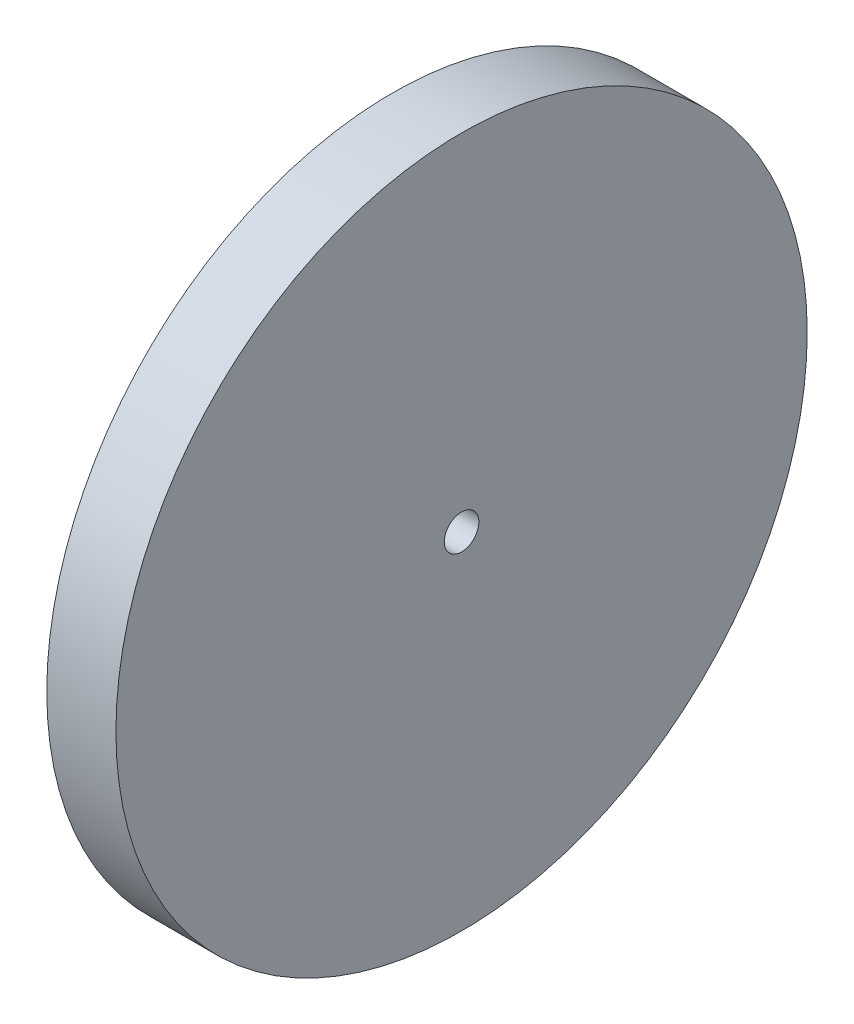
ISO-10303-21;
HEADER;
FILE_DESCRIPTION(('STEP AP214'),'2;1');
FILE_NAME('part.step','',(''),(''),'','','');
FILE_SCHEMA(('AUTOMOTIVE_DESIGN { 1 0 10303 214 1 1 1 1 }'));
ENDSEC;
DATA;
#1=APPLICATION_CONTEXT('core data for automotive mechanical design processes');
#2=APPLICATION_PROTOCOL_DEFINITION('international standard','automotive_design',2000,#1);
#3=PRODUCT_CONTEXT('',#1,'mechanical');
#4=PRODUCT('Part','Part','',(#3));
#5=PRODUCT_RELATED_PRODUCT_CATEGORY('part','',(#4));
#6=PRODUCT_DEFINITION_FORMATION('','',#4);
#7=PRODUCT_DEFINITION_CONTEXT('part definition',#1,'design');
#8=PRODUCT_DEFINITION('design','',#6,#7);
#9=PRODUCT_DEFINITION_SHAPE('','',#8);
#10=(LENGTH_UNIT() NAMED_UNIT(*) SI_UNIT(.MILLI.,.METRE.));
#11=(NAMED_UNIT(*) PLANE_ANGLE_UNIT() SI_UNIT($,.RADIAN.));
#12=(NAMED_UNIT(*) SI_UNIT($,.STERADIAN.) SOLID_ANGLE_UNIT());
#13=UNCERTAINTY_MEASURE_WITH_UNIT(LENGTH_MEASURE(1.E-05),#10,'distance_accuracy_value','');
#14=(GEOMETRIC_REPRESENTATION_CONTEXT(3) GLOBAL_UNCERTAINTY_ASSIGNED_CONTEXT((#13)) GLOBAL_UNIT_ASSIGNED_CONTEXT((#10,
#11,#12)) REPRESENTATION_CONTEXT('',''));
#15=CARTESIAN_POINT('',(0.,0.,0.));
#16=DIRECTION('',(0.,0.,1.));
#17=DIRECTION('',(1.,0.,0.));
#18=AXIS2_PLACEMENT_3D('',#15,#16,#17);
#19=CARTESIAN_POINT('',(-5.,0.,0.));
#20=DIRECTION('',(1.,0.,0.));
#21=DIRECTION('',(0.,0.,-1.));
#22=AXIS2_PLACEMENT_3D('',#19,#20,#21);
#23=CYLINDRICAL_SURFACE('',#22,50.);
#24=CARTESIAN_POINT('',(-5.,0.,0.));
#25=DIRECTION('',(1.,0.,0.));
#26=DIRECTION('',(0.,0.,-1.));
#27=AXIS2_PLACEMENT_3D('',#24,#25,#26);
#28=CIRCLE('',#27,50.);
#29=CARTESIAN_POINT('',(-5.,0.,-50.));
#30=VERTEX_POINT('',#29);
#31=EDGE_CURVE('E10',#30,#30,#28,.T.);
#32=ORIENTED_EDGE('',*,*,#31,.T.);
#33=EDGE_LOOP('',(#32));
#34=FACE_BOUND('',#33,.T.);
#35=CARTESIAN_POINT('',(5.,0.,0.));
#36=DIRECTION('',(1.,0.,0.));
#37=DIRECTION('',(0.,0.,-1.));
#38=AXIS2_PLACEMENT_3D('',#35,#36,#37);
#39=CIRCLE('',#38,50.);
#40=CARTESIAN_POINT('',(5.,0.,-50.));
#41=VERTEX_POINT('',#40);
#42=EDGE_CURVE('E36',#41,#41,#39,.T.);
#43=ORIENTED_EDGE('',*,*,#42,.F.);
#44=EDGE_LOOP('',(#43));
#45=FACE_BOUND('',#44,.T.);
#46=ADVANCED_FACE('F30',(#34,#45),#23,.T.);
#47=CARTESIAN_POINT('',(-5.,0.,0.));
#48=DIRECTION('',(1.,0.,0.));
#49=DIRECTION('',(0.,0.,-1.));
#50=AXIS2_PLACEMENT_3D('',#47,#48,#49);
#51=PLANE('',#50);
#52=CARTESIAN_POINT('',(-5.,0.,0.));
#53=DIRECTION('',(1.,0.,0.));
#54=DIRECTION('',(0.,0.,-1.));
#55=AXIS2_PLACEMENT_3D('',#52,#53,#54);
#56=CIRCLE('',#55,2.5);
#57=CARTESIAN_POINT('',(-5.,0.,-2.5));
#58=VERTEX_POINT('',#57);
#59=EDGE_CURVE('E40',#58,#58,#56,.T.);
#60=ORIENTED_EDGE('',*,*,#59,.T.);
#61=EDGE_LOOP('',(#60));
#62=FACE_BOUND('',#61,.T.);
#63=ORIENTED_EDGE('',*,*,#31,.F.);
#64=EDGE_LOOP('',(#63));
#65=FACE_BOUND('',#64,.T.);
#66=ADVANCED_FACE('F54',(#62,#65),#51,.F.);
#67=CARTESIAN_POINT('',(5.,0.,0.));
#68=DIRECTION('',(1.,0.,0.));
#69=DIRECTION('',(0.,0.,-1.));
#70=AXIS2_PLACEMENT_3D('',#67,#68,#69);
#71=PLANE('',#70);
#72=CARTESIAN_POINT('',(5.,0.,0.));
#73=DIRECTION('',(1.,0.,0.));
#74=DIRECTION('',(0.,0.,-1.));
#75=AXIS2_PLACEMENT_3D('',#72,#73,#74);
#76=CIRCLE('',#75,2.5);
#77=CARTESIAN_POINT('',(5.,0.,-2.5));
#78=VERTEX_POINT('',#77);
#79=EDGE_CURVE('E44',#78,#78,#76,.T.);
#80=ORIENTED_EDGE('',*,*,#79,.F.);
#81=EDGE_LOOP('',(#80));
#82=FACE_BOUND('',#81,.T.);
#83=ORIENTED_EDGE('',*,*,#42,.T.);
#84=EDGE_LOOP('',(#83));
#85=FACE_BOUND('',#84,.T.);
#86=ADVANCED_FACE('F52',(#82,#85),#71,.T.);
#87=CARTESIAN_POINT('',(-5.,0.,0.));
#88=DIRECTION('',(1.,0.,0.));
#89=DIRECTION('',(0.,0.,-1.));
#90=AXIS2_PLACEMENT_3D('',#87,#88,#89);
#91=CYLINDRICAL_SURFACE('',#90,2.5);
#92=ORIENTED_EDGE('',*,*,#59,.F.);
#93=EDGE_LOOP('',(#92));
#94=FACE_BOUND('',#93,.T.);
#95=ORIENTED_EDGE('',*,*,#79,.T.);
#96=EDGE_LOOP('',(#95));
#97=FACE_BOUND('',#96,.T.);
#98=ADVANCED_FACE('F50',(#94,#97),#91,.F.);
#99=CLOSED_SHELL('',(#46,#66,#86,#98));
#100=MANIFOLD_SOLID_BREP('B2',#99);
#101=ADVANCED_BREP_SHAPE_REPRESENTATION('',(#18,#100),#14);
#102=SHAPE_DEFINITION_REPRESENTATION(#9,#101);
ENDSEC;
END-ISO-10303-21;
